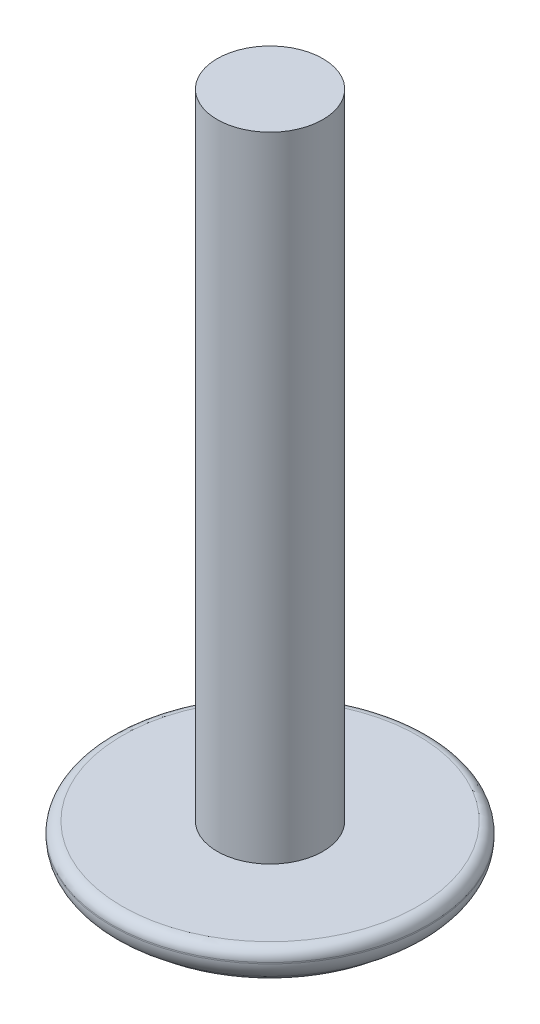
ISO-10303-21;
HEADER;
FILE_DESCRIPTION(('STEP AP214'),'2;1');
FILE_NAME('part.step','',(''),(''),'','','');
FILE_SCHEMA(('AUTOMOTIVE_DESIGN { 1 0 10303 214 1 1 1 1 }'));
ENDSEC;
DATA;
#1=APPLICATION_CONTEXT('core data for automotive mechanical design processes');
#2=APPLICATION_PROTOCOL_DEFINITION('international standard','automotive_design',2000,#1);
#3=PRODUCT_CONTEXT('',#1,'mechanical');
#4=PRODUCT('Part','Part','',(#3));
#5=PRODUCT_RELATED_PRODUCT_CATEGORY('part','',(#4));
#6=PRODUCT_DEFINITION_FORMATION('','',#4);
#7=PRODUCT_DEFINITION_CONTEXT('part definition',#1,'design');
#8=PRODUCT_DEFINITION('design','',#6,#7);
#9=PRODUCT_DEFINITION_SHAPE('','',#8);
#10=(LENGTH_UNIT() NAMED_UNIT(*) SI_UNIT(.MILLI.,.METRE.));
#11=(NAMED_UNIT(*) PLANE_ANGLE_UNIT() SI_UNIT($,.RADIAN.));
#12=(NAMED_UNIT(*) SI_UNIT($,.STERADIAN.) SOLID_ANGLE_UNIT());
#13=UNCERTAINTY_MEASURE_WITH_UNIT(LENGTH_MEASURE(1.E-05),#10,'distance_accuracy_value','');
#14=(GEOMETRIC_REPRESENTATION_CONTEXT(3) GLOBAL_UNCERTAINTY_ASSIGNED_CONTEXT((#13)) GLOBAL_UNIT_ASSIGNED_CONTEXT((#10,
#11,#12)) REPRESENTATION_CONTEXT('',''));
#15=CARTESIAN_POINT('',(0.,0.,0.));
#16=DIRECTION('',(0.,0.,1.));
#17=DIRECTION('',(1.,0.,0.));
#18=AXIS2_PLACEMENT_3D('',#15,#16,#17);
#19=CARTESIAN_POINT('',(0.,-13.8486157487969,0.));
#20=DIRECTION('',(0.,-1.,0.));
#21=DIRECTION('',(0.,0.,-1.));
#22=AXIS2_PLACEMENT_3D('',#19,#20,#21);
#23=CYLINDRICAL_SURFACE('',#22,7.5);
#24=CARTESIAN_POINT('',(0.,-0.559085350599628,0.));
#25=DIRECTION('',(0.,1.,0.));
#26=DIRECTION('',(0.,0.,1.));
#27=AXIS2_PLACEMENT_3D('',#24,#25,#26);
#28=CIRCLE('',#27,7.5);
#29=CARTESIAN_POINT('',(0.,-0.559085350599628,7.5));
#30=VERTEX_POINT('',#29);
#31=EDGE_CURVE('E10',#30,#30,#28,.T.);
#32=ORIENTED_EDGE('',*,*,#31,.T.);
#33=EDGE_LOOP('',(#32));
#34=FACE_BOUND('',#33,.T.);
#35=CARTESIAN_POINT('',(0.,-0.5,0.));
#36=DIRECTION('',(0.,1.,0.));
#37=DIRECTION('',(0.,0.,1.));
#38=AXIS2_PLACEMENT_3D('',#35,#36,#37);
#39=CIRCLE('',#38,7.5);
#40=CARTESIAN_POINT('',(0.,-0.5,7.5));
#41=VERTEX_POINT('',#40);
#42=EDGE_CURVE('E57',#41,#41,#39,.F.);
#43=ORIENTED_EDGE('',*,*,#42,.T.);
#44=EDGE_LOOP('',(#43));
#45=FACE_BOUND('',#44,.T.);
#46=ADVANCED_FACE('F41',(#34,#45),#23,.T.);
#47=CARTESIAN_POINT('',(0.,6.875,0.));
#48=DIRECTION('',(0.,-1.,0.));
#49=DIRECTION('',(0.,0.,1.));
#50=AXIS2_PLACEMENT_3D('',#47,#48,#49);
#51=SPHERICAL_SURFACE('',#50,10.875);
#52=CARTESIAN_POINT('',(0.,-1.3119041202806,0.));
#53=DIRECTION('',(0.,1.,0.));
#54=DIRECTION('',(0.,0.,1.));
#55=AXIS2_PLACEMENT_3D('',#52,#53,#54);
#56=CIRCLE('',#55,7.15822784810127);
#57=CARTESIAN_POINT('',(0.,-1.3119041202806,7.15822784810127));
#58=VERTEX_POINT('',#57);
#59=EDGE_CURVE('E48',#58,#58,#56,.F.);
#60=ORIENTED_EDGE('',*,*,#59,.T.);
#61=EDGE_LOOP('',(#60));
#62=FACE_BOUND('',#61,.T.);
#63=ADVANCED_FACE('F85',(#62),#51,.T.);
#64=CARTESIAN_POINT('',(0.,30.,0.));
#65=DIRECTION('',(0.,1.,0.));
#66=DIRECTION('',(0.,0.,1.));
#67=AXIS2_PLACEMENT_3D('',#64,#65,#66);
#68=PLANE('',#67);
#69=CARTESIAN_POINT('',(0.,30.,0.));
#70=DIRECTION('',(0.,-1.,0.));
#71=DIRECTION('',(0.,0.,-1.));
#72=AXIS2_PLACEMENT_3D('',#69,#70,#71);
#73=CIRCLE('',#72,2.5);
#74=CARTESIAN_POINT('',(0.,30.,-2.5));
#75=VERTEX_POINT('',#74);
#76=EDGE_CURVE('E61',#75,#75,#73,.T.);
#77=ORIENTED_EDGE('',*,*,#76,.F.);
#78=EDGE_LOOP('',(#77));
#79=FACE_BOUND('',#78,.T.);
#80=ADVANCED_FACE('F75',(#79),#68,.T.);
#81=CARTESIAN_POINT('',(0.,-13.8486157487969,0.));
#82=DIRECTION('',(0.,-1.,0.));
#83=DIRECTION('',(0.,0.,-1.));
#84=AXIS2_PLACEMENT_3D('',#81,#82,#83);
#85=CYLINDRICAL_SURFACE('',#84,2.5);
#86=ORIENTED_EDGE('',*,*,#76,.T.);
#87=EDGE_LOOP('',(#86));
#88=FACE_BOUND('',#87,.T.);
#89=CARTESIAN_POINT('',(0.,0.,0.));
#90=DIRECTION('',(0.,-1.,0.));
#91=DIRECTION('',(0.,0.,-1.));
#92=AXIS2_PLACEMENT_3D('',#89,#90,#91);
#93=CIRCLE('',#92,2.5);
#94=CARTESIAN_POINT('',(0.,0.,-2.5));
#95=VERTEX_POINT('',#94);
#96=EDGE_CURVE('E63',#95,#95,#93,.T.);
#97=ORIENTED_EDGE('',*,*,#96,.F.);
#98=EDGE_LOOP('',(#97));
#99=FACE_BOUND('',#98,.T.);
#100=ADVANCED_FACE('F68',(#88,#99),#85,.T.);
#101=CARTESIAN_POINT('',(0.,0.,0.));
#102=DIRECTION('',(0.,1.,0.));
#103=DIRECTION('',(0.,0.,1.));
#104=AXIS2_PLACEMENT_3D('',#101,#102,#103);
#105=PLANE('',#104);
#106=CARTESIAN_POINT('',(0.,0.,0.));
#107=DIRECTION('',(0.,1.,0.));
#108=DIRECTION('',(0.,0.,1.));
#109=AXIS2_PLACEMENT_3D('',#106,#107,#108);
#110=CIRCLE('',#109,7.);
#111=CARTESIAN_POINT('',(0.,0.,7.));
#112=VERTEX_POINT('',#111);
#113=EDGE_CURVE('E55',#112,#112,#110,.T.);
#114=ORIENTED_EDGE('',*,*,#113,.T.);
#115=EDGE_LOOP('',(#114));
#116=FACE_BOUND('',#115,.T.);
#117=ORIENTED_EDGE('',*,*,#96,.T.);
#118=EDGE_LOOP('',(#117));
#119=FACE_BOUND('',#118,.T.);
#120=ADVANCED_FACE('F69',(#116,#119),#105,.T.);
#121=CARTESIAN_POINT('',(0.,-0.5,0.));
#122=DIRECTION('',(0.,1.,0.));
#123=DIRECTION('',(0.,0.,1.));
#124=AXIS2_PLACEMENT_3D('',#121,#122,#123);
#125=TOROIDAL_SURFACE('',#124,7.,0.5);
#126=ORIENTED_EDGE('',*,*,#113,.F.);
#127=EDGE_LOOP('',(#126));
#128=FACE_BOUND('',#127,.T.);
#129=ORIENTED_EDGE('',*,*,#42,.F.);
#130=EDGE_LOOP('',(#129));
#131=FACE_BOUND('',#130,.T.);
#132=ADVANCED_FACE('F78',(#128,#131),#125,.T.);
#133=CARTESIAN_POINT('',(0.,-0.559085350599627,0.));
#134=DIRECTION('',(0.,1.,0.));
#135=DIRECTION('',(0.,0.,1.));
#136=AXIS2_PLACEMENT_3D('',#133,#134,#135);
#137=TOROIDAL_SURFACE('',#136,6.5,1.);
#138=ORIENTED_EDGE('',*,*,#31,.F.);
#139=EDGE_LOOP('',(#138));
#140=FACE_BOUND('',#139,.T.);
#141=ORIENTED_EDGE('',*,*,#59,.F.);
#142=EDGE_LOOP('',(#141));
#143=FACE_BOUND('',#142,.T.);
#144=ADVANCED_FACE('F43',(#140,#143),#137,.T.);
#145=CLOSED_SHELL('',(#46,#63,#80,#100,#120,#132,#144));
#146=MANIFOLD_SOLID_BREP('B2',#145);
#147=ADVANCED_BREP_SHAPE_REPRESENTATION('',(#18,#146),#14);
#148=SHAPE_DEFINITION_REPRESENTATION(#9,#147);
ENDSEC;
END-ISO-10303-21;
